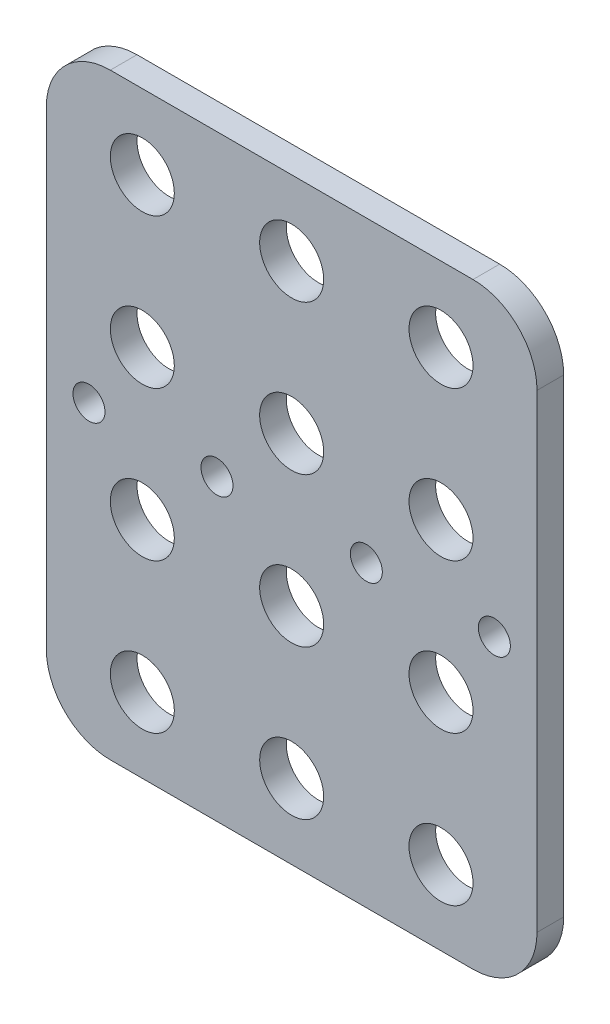
ISO-10303-21;
HEADER;
FILE_DESCRIPTION(('STEP AP214'),'2;1');
FILE_NAME('part.step','',(''),(''),'','','');
FILE_SCHEMA(('AUTOMOTIVE_DESIGN { 1 0 10303 214 1 1 1 1 }'));
ENDSEC;
DATA;
#1=APPLICATION_CONTEXT('core data for automotive mechanical design processes');
#2=APPLICATION_PROTOCOL_DEFINITION('international standard','automotive_design',2000,#1);
#3=PRODUCT_CONTEXT('',#1,'mechanical');
#4=PRODUCT('Part','Part','',(#3));
#5=PRODUCT_RELATED_PRODUCT_CATEGORY('part','',(#4));
#6=PRODUCT_DEFINITION_FORMATION('','',#4);
#7=PRODUCT_DEFINITION_CONTEXT('part definition',#1,'design');
#8=PRODUCT_DEFINITION('design','',#6,#7);
#9=PRODUCT_DEFINITION_SHAPE('','',#8);
#10=(LENGTH_UNIT() NAMED_UNIT(*) SI_UNIT(.MILLI.,.METRE.));
#11=(NAMED_UNIT(*) PLANE_ANGLE_UNIT() SI_UNIT($,.RADIAN.));
#12=(NAMED_UNIT(*) SI_UNIT($,.STERADIAN.) SOLID_ANGLE_UNIT());
#13=UNCERTAINTY_MEASURE_WITH_UNIT(LENGTH_MEASURE(1.E-05),#10,'distance_accuracy_value','');
#14=(GEOMETRIC_REPRESENTATION_CONTEXT(3) GLOBAL_UNCERTAINTY_ASSIGNED_CONTEXT((#13)) GLOBAL_UNIT_ASSIGNED_CONTEXT((#10,
#11,#12)) REPRESENTATION_CONTEXT('',''));
#15=CARTESIAN_POINT('',(0.,0.,0.));
#16=DIRECTION('',(0.,0.,1.));
#17=DIRECTION('',(1.,0.,0.));
#18=AXIS2_PLACEMENT_3D('',#15,#16,#17);
#19=CARTESIAN_POINT('',(23.,28.,2.5));
#20=DIRECTION('',(-1.,0.,0.));
#21=DIRECTION('',(0.,0.,1.));
#22=AXIS2_PLACEMENT_3D('',#19,#20,#21);
#23=PLANE('',#22);
#24=DIRECTION('',(0.,1.,0.));
#25=VECTOR('',#24,1.);
#26=CARTESIAN_POINT('',(23.,28.,0.));
#27=LINE('',#26,#25);
#28=CARTESIAN_POINT('',(23.,-22.,0.));
#29=VERTEX_POINT('',#28);
#30=CARTESIAN_POINT('',(23.,22.,0.));
#31=VERTEX_POINT('',#30);
#32=EDGE_CURVE('E132',#29,#31,#27,.T.);
#33=ORIENTED_EDGE('',*,*,#32,.T.);
#34=DIRECTION('',(0.,0.,-1.));
#35=VECTOR('',#34,1.);
#36=CARTESIAN_POINT('',(23.,22.,2.5));
#37=LINE('',#36,#35);
#38=CARTESIAN_POINT('',(23.,22.,2.5));
#39=VERTEX_POINT('',#38);
#40=EDGE_CURVE('E110',#31,#39,#37,.F.);
#41=ORIENTED_EDGE('',*,*,#40,.T.);
#42=DIRECTION('',(0.,1.,0.));
#43=VECTOR('',#42,1.);
#44=CARTESIAN_POINT('',(23.,28.,2.5));
#45=LINE('',#44,#43);
#46=CARTESIAN_POINT('',(23.,-22.,2.5));
#47=VERTEX_POINT('',#46);
#48=EDGE_CURVE('E142',#47,#39,#45,.T.);
#49=ORIENTED_EDGE('',*,*,#48,.F.);
#50=DIRECTION('',(0.,0.,-1.));
#51=VECTOR('',#50,1.);
#52=CARTESIAN_POINT('',(23.,-22.,2.5));
#53=LINE('',#52,#51);
#54=EDGE_CURVE('E115',#47,#29,#53,.T.);
#55=ORIENTED_EDGE('',*,*,#54,.T.);
#56=EDGE_LOOP('',(#33,#41,#49,#55));
#57=FACE_BOUND('',#56,.T.);
#58=ADVANCED_FACE('F37',(#57),#23,.F.);
#59=CARTESIAN_POINT('',(-23.,28.,2.5));
#60=DIRECTION('',(0.,-1.,0.));
#61=DIRECTION('',(0.,0.,-1.));
#62=AXIS2_PLACEMENT_3D('',#59,#60,#61);
#63=PLANE('',#62);
#64=DIRECTION('',(-1.,0.,0.));
#65=VECTOR('',#64,1.);
#66=CARTESIAN_POINT('',(-23.,28.,2.5));
#67=LINE('',#66,#65);
#68=CARTESIAN_POINT('',(17.,28.,2.5));
#69=VERTEX_POINT('',#68);
#70=CARTESIAN_POINT('',(-17.,28.,2.5));
#71=VERTEX_POINT('',#70);
#72=EDGE_CURVE('E125',#69,#71,#67,.T.);
#73=ORIENTED_EDGE('',*,*,#72,.F.);
#74=DIRECTION('',(0.,0.,-1.));
#75=VECTOR('',#74,1.);
#76=CARTESIAN_POINT('',(17.,28.,2.5));
#77=LINE('',#76,#75);
#78=CARTESIAN_POINT('',(17.,28.,0.));
#79=VERTEX_POINT('',#78);
#80=EDGE_CURVE('E109',#69,#79,#77,.T.);
#81=ORIENTED_EDGE('',*,*,#80,.T.);
#82=DIRECTION('',(-1.,0.,0.));
#83=VECTOR('',#82,1.);
#84=CARTESIAN_POINT('',(-23.,28.,0.));
#85=LINE('',#84,#83);
#86=CARTESIAN_POINT('',(-17.,28.,0.));
#87=VERTEX_POINT('',#86);
#88=EDGE_CURVE('E122',#79,#87,#85,.T.);
#89=ORIENTED_EDGE('',*,*,#88,.T.);
#90=DIRECTION('',(0.,0.,-1.));
#91=VECTOR('',#90,1.);
#92=CARTESIAN_POINT('',(-17.,28.,2.5));
#93=LINE('',#92,#91);
#94=EDGE_CURVE('E127',#87,#71,#93,.F.);
#95=ORIENTED_EDGE('',*,*,#94,.T.);
#96=EDGE_LOOP('',(#73,#81,#89,#95));
#97=FACE_BOUND('',#96,.T.);
#98=ADVANCED_FACE('F121',(#97),#63,.F.);
#99=CARTESIAN_POINT('',(-23.,28.,2.5));
#100=DIRECTION('',(1.,0.,0.));
#101=DIRECTION('',(0.,0.,-1.));
#102=AXIS2_PLACEMENT_3D('',#99,#100,#101);
#103=PLANE('',#102);
#104=DIRECTION('',(0.,-1.,0.));
#105=VECTOR('',#104,1.);
#106=CARTESIAN_POINT('',(-23.,28.,0.));
#107=LINE('',#106,#105);
#108=CARTESIAN_POINT('',(-23.,22.,0.));
#109=VERTEX_POINT('',#108);
#110=CARTESIAN_POINT('',(-23.,-22.,0.));
#111=VERTEX_POINT('',#110);
#112=EDGE_CURVE('E131',#109,#111,#107,.T.);
#113=ORIENTED_EDGE('',*,*,#112,.T.);
#114=DIRECTION('',(0.,0.,-1.));
#115=VECTOR('',#114,1.);
#116=CARTESIAN_POINT('',(-23.,-22.,2.5));
#117=LINE('',#116,#115);
#118=CARTESIAN_POINT('',(-23.,-22.,2.5));
#119=VERTEX_POINT('',#118);
#120=EDGE_CURVE('E11',#111,#119,#117,.F.);
#121=ORIENTED_EDGE('',*,*,#120,.T.);
#122=DIRECTION('',(0.,-1.,0.));
#123=VECTOR('',#122,1.);
#124=CARTESIAN_POINT('',(-23.,28.,2.5));
#125=LINE('',#124,#123);
#126=CARTESIAN_POINT('',(-23.,22.,2.5));
#127=VERTEX_POINT('',#126);
#128=EDGE_CURVE('E237',#127,#119,#125,.T.);
#129=ORIENTED_EDGE('',*,*,#128,.F.);
#130=DIRECTION('',(0.,0.,-1.));
#131=VECTOR('',#130,1.);
#132=CARTESIAN_POINT('',(-23.,22.,2.5));
#133=LINE('',#132,#131);
#134=EDGE_CURVE('E46',#127,#109,#133,.T.);
#135=ORIENTED_EDGE('',*,*,#134,.T.);
#136=EDGE_LOOP('',(#113,#121,#129,#135));
#137=FACE_BOUND('',#136,.T.);
#138=ADVANCED_FACE('F252',(#137),#103,.F.);
#139=CARTESIAN_POINT('',(-23.,-28.,2.5));
#140=DIRECTION('',(0.,1.,0.));
#141=DIRECTION('',(0.,0.,1.));
#142=AXIS2_PLACEMENT_3D('',#139,#140,#141);
#143=PLANE('',#142);
#144=DIRECTION('',(1.,0.,0.));
#145=VECTOR('',#144,1.);
#146=CARTESIAN_POINT('',(-23.,-28.,0.));
#147=LINE('',#146,#145);
#148=CARTESIAN_POINT('',(-17.,-28.,0.));
#149=VERTEX_POINT('',#148);
#150=CARTESIAN_POINT('',(17.,-28.,0.));
#151=VERTEX_POINT('',#150);
#152=EDGE_CURVE('E135',#149,#151,#147,.T.);
#153=ORIENTED_EDGE('',*,*,#152,.T.);
#154=DIRECTION('',(0.,0.,-1.));
#155=VECTOR('',#154,1.);
#156=CARTESIAN_POINT('',(17.,-28.,2.5));
#157=LINE('',#156,#155);
#158=CARTESIAN_POINT('',(17.,-28.,2.5));
#159=VERTEX_POINT('',#158);
#160=EDGE_CURVE('E54',#151,#159,#157,.F.);
#161=ORIENTED_EDGE('',*,*,#160,.T.);
#162=DIRECTION('',(1.,0.,0.));
#163=VECTOR('',#162,1.);
#164=CARTESIAN_POINT('',(-23.,-28.,2.5));
#165=LINE('',#164,#163);
#166=CARTESIAN_POINT('',(-17.,-28.,2.5));
#167=VERTEX_POINT('',#166);
#168=EDGE_CURVE('E143',#167,#159,#165,.T.);
#169=ORIENTED_EDGE('',*,*,#168,.F.);
#170=DIRECTION('',(0.,0.,-1.));
#171=VECTOR('',#170,1.);
#172=CARTESIAN_POINT('',(-17.,-28.,2.5));
#173=LINE('',#172,#171);
#174=EDGE_CURVE('E159',#167,#149,#173,.T.);
#175=ORIENTED_EDGE('',*,*,#174,.T.);
#176=EDGE_LOOP('',(#153,#161,#169,#175));
#177=FACE_BOUND('',#176,.T.);
#178=ADVANCED_FACE('F247',(#177),#143,.F.);
#179=CARTESIAN_POINT('',(0.,0.,2.5));
#180=DIRECTION('',(0.,0.,1.));
#181=DIRECTION('',(1.,0.,0.));
#182=AXIS2_PLACEMENT_3D('',#179,#180,#181);
#183=PLANE('',#182);
#184=CARTESIAN_POINT('',(-14.,-21.,2.5));
#185=DIRECTION('',(0.,0.,1.));
#186=DIRECTION('',(-1.,0.,0.));
#187=AXIS2_PLACEMENT_3D('',#184,#185,#186);
#188=CIRCLE('',#187,3.);
#189=CARTESIAN_POINT('',(-17.,-21.,2.5));
#190=VERTEX_POINT('',#189);
#191=EDGE_CURVE('E498',#190,#190,#188,.T.);
#192=ORIENTED_EDGE('',*,*,#191,.F.);
#193=EDGE_LOOP('',(#192));
#194=FACE_BOUND('',#193,.T.);
#195=CARTESIAN_POINT('',(0.,-21.,2.5));
#196=DIRECTION('',(0.,0.,1.));
#197=DIRECTION('',(-1.,0.,0.));
#198=AXIS2_PLACEMENT_3D('',#195,#196,#197);
#199=CIRCLE('',#198,3.);
#200=CARTESIAN_POINT('',(-2.99999999999999,-21.,2.5));
#201=VERTEX_POINT('',#200);
#202=EDGE_CURVE('E499',#201,#201,#199,.T.);
#203=ORIENTED_EDGE('',*,*,#202,.F.);
#204=EDGE_LOOP('',(#203));
#205=FACE_BOUND('',#204,.T.);
#206=CARTESIAN_POINT('',(14.,-21.,2.5));
#207=DIRECTION('',(0.,0.,1.));
#208=DIRECTION('',(-1.,0.,0.));
#209=AXIS2_PLACEMENT_3D('',#206,#207,#208);
#210=CIRCLE('',#209,3.);
#211=CARTESIAN_POINT('',(11.,-21.,2.5));
#212=VERTEX_POINT('',#211);
#213=EDGE_CURVE('E502',#212,#212,#210,.T.);
#214=ORIENTED_EDGE('',*,*,#213,.F.);
#215=EDGE_LOOP('',(#214));
#216=FACE_BOUND('',#215,.T.);
#217=CARTESIAN_POINT('',(14.,21.,2.5));
#218=DIRECTION('',(0.,0.,1.));
#219=DIRECTION('',(1.,0.,0.));
#220=AXIS2_PLACEMENT_3D('',#217,#218,#219);
#221=CIRCLE('',#220,3.);
#222=CARTESIAN_POINT('',(17.,21.,2.5));
#223=VERTEX_POINT('',#222);
#224=EDGE_CURVE('E571',#223,#223,#221,.T.);
#225=ORIENTED_EDGE('',*,*,#224,.F.);
#226=EDGE_LOOP('',(#225));
#227=FACE_BOUND('',#226,.T.);
#228=CARTESIAN_POINT('',(0.,21.,2.5));
#229=DIRECTION('',(0.,0.,1.));
#230=DIRECTION('',(1.,0.,0.));
#231=AXIS2_PLACEMENT_3D('',#228,#229,#230);
#232=CIRCLE('',#231,3.);
#233=CARTESIAN_POINT('',(3.00000000000001,21.,2.5));
#234=VERTEX_POINT('',#233);
#235=EDGE_CURVE('E567',#234,#234,#232,.T.);
#236=ORIENTED_EDGE('',*,*,#235,.F.);
#237=EDGE_LOOP('',(#236));
#238=FACE_BOUND('',#237,.T.);
#239=CARTESIAN_POINT('',(14.0000000000002,-7.,2.5));
#240=DIRECTION('',(0.,0.,1.));
#241=DIRECTION('',(1.,0.,0.));
#242=AXIS2_PLACEMENT_3D('',#239,#240,#241);
#243=CIRCLE('',#242,3.);
#244=CARTESIAN_POINT('',(17.0000000000002,-7.,2.5));
#245=VERTEX_POINT('',#244);
#246=EDGE_CURVE('E514',#245,#245,#243,.T.);
#247=ORIENTED_EDGE('',*,*,#246,.F.);
#248=EDGE_LOOP('',(#247));
#249=FACE_BOUND('',#248,.T.);
#250=CARTESIAN_POINT('',(0.,7.,2.5));
#251=DIRECTION('',(0.,0.,1.));
#252=DIRECTION('',(1.,0.,0.));
#253=AXIS2_PLACEMENT_3D('',#250,#251,#252);
#254=CIRCLE('',#253,3.);
#255=CARTESIAN_POINT('',(3.00000000000001,7.,2.5));
#256=VERTEX_POINT('',#255);
#257=EDGE_CURVE('E187',#256,#256,#254,.T.);
#258=ORIENTED_EDGE('',*,*,#257,.F.);
#259=EDGE_LOOP('',(#258));
#260=FACE_BOUND('',#259,.T.);
#261=CARTESIAN_POINT('',(14.,7.,2.5));
#262=DIRECTION('',(0.,0.,1.));
#263=DIRECTION('',(1.,0.,0.));
#264=AXIS2_PLACEMENT_3D('',#261,#262,#263);
#265=CIRCLE('',#264,3.);
#266=CARTESIAN_POINT('',(17.,7.,2.5));
#267=VERTEX_POINT('',#266);
#268=EDGE_CURVE('E223',#267,#267,#265,.T.);
#269=ORIENTED_EDGE('',*,*,#268,.F.);
#270=EDGE_LOOP('',(#269));
#271=FACE_BOUND('',#270,.T.);
#272=CARTESIAN_POINT('',(-14.,21.,2.5));
#273=DIRECTION('',(0.,0.,1.));
#274=DIRECTION('',(1.,0.,0.));
#275=AXIS2_PLACEMENT_3D('',#272,#273,#274);
#276=CIRCLE('',#275,3.);
#277=CARTESIAN_POINT('',(-11.,21.,2.5));
#278=VERTEX_POINT('',#277);
#279=EDGE_CURVE('E506',#278,#278,#276,.T.);
#280=ORIENTED_EDGE('',*,*,#279,.F.);
#281=EDGE_LOOP('',(#280));
#282=FACE_BOUND('',#281,.T.);
#283=CARTESIAN_POINT('',(-13.9999999999998,-7.,2.5));
#284=DIRECTION('',(0.,0.,1.));
#285=DIRECTION('',(1.,0.,0.));
#286=AXIS2_PLACEMENT_3D('',#283,#284,#285);
#287=CIRCLE('',#286,3.);
#288=CARTESIAN_POINT('',(-10.9999999999998,-7.,2.5));
#289=VERTEX_POINT('',#288);
#290=EDGE_CURVE('E509',#289,#289,#287,.T.);
#291=ORIENTED_EDGE('',*,*,#290,.F.);
#292=EDGE_LOOP('',(#291));
#293=FACE_BOUND('',#292,.T.);
#294=CARTESIAN_POINT('',(1.60520004039226E-13,-7.,2.5));
#295=DIRECTION('',(0.,0.,1.));
#296=DIRECTION('',(1.,0.,0.));
#297=AXIS2_PLACEMENT_3D('',#294,#295,#296);
#298=CIRCLE('',#297,3.);
#299=CARTESIAN_POINT('',(3.00000000000016,-7.,2.5));
#300=VERTEX_POINT('',#299);
#301=EDGE_CURVE('E512',#300,#300,#298,.T.);
#302=ORIENTED_EDGE('',*,*,#301,.F.);
#303=EDGE_LOOP('',(#302));
#304=FACE_BOUND('',#303,.T.);
#305=CARTESIAN_POINT('',(-14.,7.,2.5));
#306=DIRECTION('',(0.,0.,1.));
#307=DIRECTION('',(1.,0.,0.));
#308=AXIS2_PLACEMENT_3D('',#305,#306,#307);
#309=CIRCLE('',#308,3.);
#310=CARTESIAN_POINT('',(-11.,7.,2.5));
#311=VERTEX_POINT('',#310);
#312=EDGE_CURVE('E182',#311,#311,#309,.T.);
#313=ORIENTED_EDGE('',*,*,#312,.F.);
#314=EDGE_LOOP('',(#313));
#315=FACE_BOUND('',#314,.T.);
#316=CARTESIAN_POINT('',(-6.99999999999999,0.,2.5));
#317=DIRECTION('',(0.,0.,1.));
#318=DIRECTION('',(1.,0.,0.));
#319=AXIS2_PLACEMENT_3D('',#316,#317,#318);
#320=CIRCLE('',#319,1.5);
#321=CARTESIAN_POINT('',(-5.49999999999999,0.,2.5));
#322=VERTEX_POINT('',#321);
#323=EDGE_CURVE('E172',#322,#322,#320,.T.);
#324=ORIENTED_EDGE('',*,*,#323,.F.);
#325=EDGE_LOOP('',(#324));
#326=FACE_BOUND('',#325,.T.);
#327=CARTESIAN_POINT('',(6.99999999999999,0.,2.5));
#328=DIRECTION('',(0.,0.,1.));
#329=DIRECTION('',(-1.,0.,0.));
#330=AXIS2_PLACEMENT_3D('',#327,#328,#329);
#331=CIRCLE('',#330,1.5);
#332=CARTESIAN_POINT('',(5.49999999999999,0.,2.5));
#333=VERTEX_POINT('',#332);
#334=EDGE_CURVE('E227',#333,#333,#331,.T.);
#335=ORIENTED_EDGE('',*,*,#334,.F.);
#336=EDGE_LOOP('',(#335));
#337=FACE_BOUND('',#336,.T.);
#338=CARTESIAN_POINT('',(19.,0.,2.5));
#339=DIRECTION('',(0.,0.,1.));
#340=DIRECTION('',(-1.,0.,0.));
#341=AXIS2_PLACEMENT_3D('',#338,#339,#340);
#342=CIRCLE('',#341,1.5);
#343=CARTESIAN_POINT('',(17.5,0.,2.5));
#344=VERTEX_POINT('',#343);
#345=EDGE_CURVE('E181',#344,#344,#342,.T.);
#346=ORIENTED_EDGE('',*,*,#345,.F.);
#347=EDGE_LOOP('',(#346));
#348=FACE_BOUND('',#347,.T.);
#349=CARTESIAN_POINT('',(-19.,0.,2.5));
#350=DIRECTION('',(0.,0.,1.));
#351=DIRECTION('',(1.,0.,0.));
#352=AXIS2_PLACEMENT_3D('',#349,#350,#351);
#353=CIRCLE('',#352,1.5);
#354=CARTESIAN_POINT('',(-17.5,0.,2.5));
#355=VERTEX_POINT('',#354);
#356=EDGE_CURVE('E167',#355,#355,#353,.T.);
#357=ORIENTED_EDGE('',*,*,#356,.F.);
#358=EDGE_LOOP('',(#357));
#359=FACE_BOUND('',#358,.T.);
#360=ORIENTED_EDGE('',*,*,#48,.T.);
#361=CARTESIAN_POINT('',(17.,22.,2.5));
#362=DIRECTION('',(0.,0.,1.));
#363=DIRECTION('',(1.,0.,0.));
#364=AXIS2_PLACEMENT_3D('',#361,#362,#363);
#365=CIRCLE('',#364,6.);
#366=EDGE_CURVE('E157',#39,#69,#365,.T.);
#367=ORIENTED_EDGE('',*,*,#366,.T.);
#368=ORIENTED_EDGE('',*,*,#72,.T.);
#369=CARTESIAN_POINT('',(-17.,22.,2.5));
#370=DIRECTION('',(0.,0.,1.));
#371=DIRECTION('',(1.,0.,0.));
#372=AXIS2_PLACEMENT_3D('',#369,#370,#371);
#373=CIRCLE('',#372,6.);
#374=EDGE_CURVE('E152',#71,#127,#373,.T.);
#375=ORIENTED_EDGE('',*,*,#374,.T.);
#376=ORIENTED_EDGE('',*,*,#128,.T.);
#377=CARTESIAN_POINT('',(-17.,-22.,2.5));
#378=DIRECTION('',(0.,0.,1.));
#379=DIRECTION('',(1.,0.,0.));
#380=AXIS2_PLACEMENT_3D('',#377,#378,#379);
#381=CIRCLE('',#380,6.);
#382=EDGE_CURVE('E61',#119,#167,#381,.T.);
#383=ORIENTED_EDGE('',*,*,#382,.T.);
#384=ORIENTED_EDGE('',*,*,#168,.T.);
#385=CARTESIAN_POINT('',(17.,-22.,2.5));
#386=DIRECTION('',(0.,0.,1.));
#387=DIRECTION('',(1.,0.,0.));
#388=AXIS2_PLACEMENT_3D('',#385,#386,#387);
#389=CIRCLE('',#388,6.);
#390=EDGE_CURVE('E155',#159,#47,#389,.T.);
#391=ORIENTED_EDGE('',*,*,#390,.T.);
#392=EDGE_LOOP('',(#360,#367,#368,#375,#376,#383,#384,#391));
#393=FACE_BOUND('',#392,.T.);
#394=ADVANCED_FACE('F239',(#194,#205,#216,#227,#238,#249,#260,#271,#282,#293,#304,#315,#326,
#337,#348,#359,#393),#183,.T.);
#395=CARTESIAN_POINT('',(0.,0.,0.));
#396=DIRECTION('',(0.,0.,1.));
#397=DIRECTION('',(1.,0.,0.));
#398=AXIS2_PLACEMENT_3D('',#395,#396,#397);
#399=PLANE('',#398);
#400=CARTESIAN_POINT('',(-14.,-21.,0.));
#401=DIRECTION('',(0.,0.,1.));
#402=DIRECTION('',(1.,0.,0.));
#403=AXIS2_PLACEMENT_3D('',#400,#401,#402);
#404=CIRCLE('',#403,3.);
#405=CARTESIAN_POINT('',(-11.,-21.,0.));
#406=VERTEX_POINT('',#405);
#407=EDGE_CURVE('E41',#406,#406,#404,.T.);
#408=ORIENTED_EDGE('',*,*,#407,.T.);
#409=EDGE_LOOP('',(#408));
#410=FACE_BOUND('',#409,.T.);
#411=CARTESIAN_POINT('',(0.,-21.,0.));
#412=DIRECTION('',(0.,0.,1.));
#413=DIRECTION('',(1.,0.,0.));
#414=AXIS2_PLACEMENT_3D('',#411,#412,#413);
#415=CIRCLE('',#414,3.);
#416=CARTESIAN_POINT('',(3.00000000000001,-21.,0.));
#417=VERTEX_POINT('',#416);
#418=EDGE_CURVE('E210',#417,#417,#415,.T.);
#419=ORIENTED_EDGE('',*,*,#418,.T.);
#420=EDGE_LOOP('',(#419));
#421=FACE_BOUND('',#420,.T.);
#422=CARTESIAN_POINT('',(14.,-21.,0.));
#423=DIRECTION('',(0.,0.,1.));
#424=DIRECTION('',(1.,0.,0.));
#425=AXIS2_PLACEMENT_3D('',#422,#423,#424);
#426=CIRCLE('',#425,3.);
#427=CARTESIAN_POINT('',(17.,-21.,0.));
#428=VERTEX_POINT('',#427);
#429=EDGE_CURVE('E208',#428,#428,#426,.T.);
#430=ORIENTED_EDGE('',*,*,#429,.T.);
#431=EDGE_LOOP('',(#430));
#432=FACE_BOUND('',#431,.T.);
#433=CARTESIAN_POINT('',(14.,21.,0.));
#434=DIRECTION('',(0.,0.,1.));
#435=DIRECTION('',(1.,0.,0.));
#436=AXIS2_PLACEMENT_3D('',#433,#434,#435);
#437=CIRCLE('',#436,3.);
#438=CARTESIAN_POINT('',(17.,21.,0.));
#439=VERTEX_POINT('',#438);
#440=EDGE_CURVE('E205',#439,#439,#437,.T.);
#441=ORIENTED_EDGE('',*,*,#440,.T.);
#442=EDGE_LOOP('',(#441));
#443=FACE_BOUND('',#442,.T.);
#444=CARTESIAN_POINT('',(0.,21.,0.));
#445=DIRECTION('',(0.,0.,1.));
#446=DIRECTION('',(1.,0.,0.));
#447=AXIS2_PLACEMENT_3D('',#444,#445,#446);
#448=CIRCLE('',#447,3.);
#449=CARTESIAN_POINT('',(3.00000000000001,21.,0.));
#450=VERTEX_POINT('',#449);
#451=EDGE_CURVE('E202',#450,#450,#448,.T.);
#452=ORIENTED_EDGE('',*,*,#451,.T.);
#453=EDGE_LOOP('',(#452));
#454=FACE_BOUND('',#453,.T.);
#455=CARTESIAN_POINT('',(14.0000000000002,-7.,0.));
#456=DIRECTION('',(0.,0.,1.));
#457=DIRECTION('',(1.,0.,0.));
#458=AXIS2_PLACEMENT_3D('',#455,#456,#457);
#459=CIRCLE('',#458,3.);
#460=CARTESIAN_POINT('',(17.0000000000002,-7.,0.));
#461=VERTEX_POINT('',#460);
#462=EDGE_CURVE('E199',#461,#461,#459,.T.);
#463=ORIENTED_EDGE('',*,*,#462,.T.);
#464=EDGE_LOOP('',(#463));
#465=FACE_BOUND('',#464,.T.);
#466=CARTESIAN_POINT('',(0.,7.,0.));
#467=DIRECTION('',(0.,0.,1.));
#468=DIRECTION('',(1.,0.,0.));
#469=AXIS2_PLACEMENT_3D('',#466,#467,#468);
#470=CIRCLE('',#469,3.);
#471=CARTESIAN_POINT('',(3.00000000000001,7.,0.));
#472=VERTEX_POINT('',#471);
#473=EDGE_CURVE('E196',#472,#472,#470,.T.);
#474=ORIENTED_EDGE('',*,*,#473,.T.);
#475=EDGE_LOOP('',(#474));
#476=FACE_BOUND('',#475,.T.);
#477=CARTESIAN_POINT('',(14.,7.,0.));
#478=DIRECTION('',(0.,0.,1.));
#479=DIRECTION('',(1.,0.,0.));
#480=AXIS2_PLACEMENT_3D('',#477,#478,#479);
#481=CIRCLE('',#480,3.);
#482=CARTESIAN_POINT('',(17.,7.,0.));
#483=VERTEX_POINT('',#482);
#484=EDGE_CURVE('E193',#483,#483,#481,.T.);
#485=ORIENTED_EDGE('',*,*,#484,.T.);
#486=EDGE_LOOP('',(#485));
#487=FACE_BOUND('',#486,.T.);
#488=CARTESIAN_POINT('',(-14.,21.,0.));
#489=DIRECTION('',(0.,0.,1.));
#490=DIRECTION('',(1.,0.,0.));
#491=AXIS2_PLACEMENT_3D('',#488,#489,#490);
#492=CIRCLE('',#491,3.);
#493=CARTESIAN_POINT('',(-11.,21.,0.));
#494=VERTEX_POINT('',#493);
#495=EDGE_CURVE('E190',#494,#494,#492,.T.);
#496=ORIENTED_EDGE('',*,*,#495,.T.);
#497=EDGE_LOOP('',(#496));
#498=FACE_BOUND('',#497,.T.);
#499=CARTESIAN_POINT('',(-13.9999999999998,-7.,0.));
#500=DIRECTION('',(0.,0.,1.));
#501=DIRECTION('',(1.,0.,0.));
#502=AXIS2_PLACEMENT_3D('',#499,#500,#501);
#503=CIRCLE('',#502,3.);
#504=CARTESIAN_POINT('',(-10.9999999999998,-7.,0.));
#505=VERTEX_POINT('',#504);
#506=EDGE_CURVE('E186',#505,#505,#503,.T.);
#507=ORIENTED_EDGE('',*,*,#506,.T.);
#508=EDGE_LOOP('',(#507));
#509=FACE_BOUND('',#508,.T.);
#510=CARTESIAN_POINT('',(1.60520004039226E-13,-7.,0.));
#511=DIRECTION('',(0.,0.,1.));
#512=DIRECTION('',(1.,0.,0.));
#513=AXIS2_PLACEMENT_3D('',#510,#511,#512);
#514=CIRCLE('',#513,3.);
#515=CARTESIAN_POINT('',(3.00000000000016,-7.,0.));
#516=VERTEX_POINT('',#515);
#517=EDGE_CURVE('E183',#516,#516,#514,.T.);
#518=ORIENTED_EDGE('',*,*,#517,.T.);
#519=EDGE_LOOP('',(#518));
#520=FACE_BOUND('',#519,.T.);
#521=CARTESIAN_POINT('',(-14.,7.,0.));
#522=DIRECTION('',(0.,0.,1.));
#523=DIRECTION('',(1.,0.,0.));
#524=AXIS2_PLACEMENT_3D('',#521,#522,#523);
#525=CIRCLE('',#524,3.);
#526=CARTESIAN_POINT('',(-11.,7.,0.));
#527=VERTEX_POINT('',#526);
#528=EDGE_CURVE('E178',#527,#527,#525,.T.);
#529=ORIENTED_EDGE('',*,*,#528,.T.);
#530=EDGE_LOOP('',(#529));
#531=FACE_BOUND('',#530,.T.);
#532=CARTESIAN_POINT('',(-6.99999999999999,0.,0.));
#533=DIRECTION('',(0.,0.,1.));
#534=DIRECTION('',(1.,0.,0.));
#535=AXIS2_PLACEMENT_3D('',#532,#533,#534);
#536=CIRCLE('',#535,1.5);
#537=CARTESIAN_POINT('',(-5.49999999999999,0.,0.));
#538=VERTEX_POINT('',#537);
#539=EDGE_CURVE('E175',#538,#538,#536,.T.);
#540=ORIENTED_EDGE('',*,*,#539,.T.);
#541=EDGE_LOOP('',(#540));
#542=FACE_BOUND('',#541,.T.);
#543=CARTESIAN_POINT('',(6.99999999999999,0.,0.));
#544=DIRECTION('',(0.,0.,1.));
#545=DIRECTION('',(1.,0.,0.));
#546=AXIS2_PLACEMENT_3D('',#543,#544,#545);
#547=CIRCLE('',#546,1.5);
#548=CARTESIAN_POINT('',(8.49999999999999,0.,0.));
#549=VERTEX_POINT('',#548);
#550=EDGE_CURVE('E171',#549,#549,#547,.T.);
#551=ORIENTED_EDGE('',*,*,#550,.T.);
#552=EDGE_LOOP('',(#551));
#553=FACE_BOUND('',#552,.T.);
#554=CARTESIAN_POINT('',(19.,0.,0.));
#555=DIRECTION('',(0.,0.,1.));
#556=DIRECTION('',(1.,0.,0.));
#557=AXIS2_PLACEMENT_3D('',#554,#555,#556);
#558=CIRCLE('',#557,1.5);
#559=CARTESIAN_POINT('',(20.5,0.,0.));
#560=VERTEX_POINT('',#559);
#561=EDGE_CURVE('E168',#560,#560,#558,.T.);
#562=ORIENTED_EDGE('',*,*,#561,.T.);
#563=EDGE_LOOP('',(#562));
#564=FACE_BOUND('',#563,.T.);
#565=CARTESIAN_POINT('',(-19.,0.,0.));
#566=DIRECTION('',(0.,0.,1.));
#567=DIRECTION('',(1.,0.,0.));
#568=AXIS2_PLACEMENT_3D('',#565,#566,#567);
#569=CIRCLE('',#568,1.5);
#570=CARTESIAN_POINT('',(-17.5,0.,0.));
#571=VERTEX_POINT('',#570);
#572=EDGE_CURVE('E137',#571,#571,#569,.T.);
#573=ORIENTED_EDGE('',*,*,#572,.T.);
#574=EDGE_LOOP('',(#573));
#575=FACE_BOUND('',#574,.T.);
#576=ORIENTED_EDGE('',*,*,#88,.F.);
#577=CARTESIAN_POINT('',(17.,22.,0.));
#578=DIRECTION('',(0.,0.,1.));
#579=DIRECTION('',(1.,0.,0.));
#580=AXIS2_PLACEMENT_3D('',#577,#578,#579);
#581=CIRCLE('',#580,6.);
#582=EDGE_CURVE('E105',#79,#31,#581,.F.);
#583=ORIENTED_EDGE('',*,*,#582,.T.);
#584=ORIENTED_EDGE('',*,*,#32,.F.);
#585=CARTESIAN_POINT('',(17.,-22.,0.));
#586=DIRECTION('',(0.,0.,1.));
#587=DIRECTION('',(1.,0.,0.));
#588=AXIS2_PLACEMENT_3D('',#585,#586,#587);
#589=CIRCLE('',#588,6.);
#590=EDGE_CURVE('E116',#29,#151,#589,.F.);
#591=ORIENTED_EDGE('',*,*,#590,.T.);
#592=ORIENTED_EDGE('',*,*,#152,.F.);
#593=CARTESIAN_POINT('',(-17.,-22.,0.));
#594=DIRECTION('',(0.,0.,1.));
#595=DIRECTION('',(1.,0.,0.));
#596=AXIS2_PLACEMENT_3D('',#593,#594,#595);
#597=CIRCLE('',#596,6.);
#598=EDGE_CURVE('E146',#149,#111,#597,.F.);
#599=ORIENTED_EDGE('',*,*,#598,.T.);
#600=ORIENTED_EDGE('',*,*,#112,.F.);
#601=CARTESIAN_POINT('',(-17.,22.,0.));
#602=DIRECTION('',(0.,0.,1.));
#603=DIRECTION('',(1.,0.,0.));
#604=AXIS2_PLACEMENT_3D('',#601,#602,#603);
#605=CIRCLE('',#604,6.);
#606=EDGE_CURVE('E126',#109,#87,#605,.F.);
#607=ORIENTED_EDGE('',*,*,#606,.T.);
#608=EDGE_LOOP('',(#576,#583,#584,#591,#592,#599,#600,#607));
#609=FACE_BOUND('',#608,.T.);
#610=ADVANCED_FACE('F129',(#410,#421,#432,#443,#454,#465,#476,#487,#498,#509,#520,#531,#542,
#553,#564,#575,#609),#399,.F.);
#611=CARTESIAN_POINT('',(17.,22.,2.5));
#612=DIRECTION('',(0.,0.,-1.));
#613=DIRECTION('',(-1.,0.,0.));
#614=AXIS2_PLACEMENT_3D('',#611,#612,#613);
#615=CYLINDRICAL_SURFACE('',#614,6.);
#616=ORIENTED_EDGE('',*,*,#366,.F.);
#617=ORIENTED_EDGE('',*,*,#40,.F.);
#618=ORIENTED_EDGE('',*,*,#582,.F.);
#619=ORIENTED_EDGE('',*,*,#80,.F.);
#620=EDGE_LOOP('',(#616,#617,#618,#619));
#621=FACE_BOUND('',#620,.T.);
#622=ADVANCED_FACE('F108',(#621),#615,.T.);
#623=CARTESIAN_POINT('',(17.,-22.,2.5));
#624=DIRECTION('',(0.,0.,-1.));
#625=DIRECTION('',(-1.,0.,0.));
#626=AXIS2_PLACEMENT_3D('',#623,#624,#625);
#627=CYLINDRICAL_SURFACE('',#626,6.);
#628=ORIENTED_EDGE('',*,*,#390,.F.);
#629=ORIENTED_EDGE('',*,*,#160,.F.);
#630=ORIENTED_EDGE('',*,*,#590,.F.);
#631=ORIENTED_EDGE('',*,*,#54,.F.);
#632=EDGE_LOOP('',(#628,#629,#630,#631));
#633=FACE_BOUND('',#632,.T.);
#634=ADVANCED_FACE('F244',(#633),#627,.T.);
#635=CARTESIAN_POINT('',(-17.,-22.,2.5));
#636=DIRECTION('',(0.,0.,-1.));
#637=DIRECTION('',(-1.,0.,0.));
#638=AXIS2_PLACEMENT_3D('',#635,#636,#637);
#639=CYLINDRICAL_SURFACE('',#638,6.);
#640=ORIENTED_EDGE('',*,*,#382,.F.);
#641=ORIENTED_EDGE('',*,*,#120,.F.);
#642=ORIENTED_EDGE('',*,*,#598,.F.);
#643=ORIENTED_EDGE('',*,*,#174,.F.);
#644=EDGE_LOOP('',(#640,#641,#642,#643));
#645=FACE_BOUND('',#644,.T.);
#646=ADVANCED_FACE('F249',(#645),#639,.T.);
#647=CARTESIAN_POINT('',(-17.,22.,2.5));
#648=DIRECTION('',(0.,0.,-1.));
#649=DIRECTION('',(-1.,0.,0.));
#650=AXIS2_PLACEMENT_3D('',#647,#648,#649);
#651=CYLINDRICAL_SURFACE('',#650,6.);
#652=ORIENTED_EDGE('',*,*,#374,.F.);
#653=ORIENTED_EDGE('',*,*,#94,.F.);
#654=ORIENTED_EDGE('',*,*,#606,.F.);
#655=ORIENTED_EDGE('',*,*,#134,.F.);
#656=EDGE_LOOP('',(#652,#653,#654,#655));
#657=FACE_BOUND('',#656,.T.);
#658=ADVANCED_FACE('F39',(#657),#651,.T.);
#659=CARTESIAN_POINT('',(-19.,0.,-7.5));
#660=DIRECTION('',(0.,0.,1.));
#661=DIRECTION('',(1.,0.,0.));
#662=AXIS2_PLACEMENT_3D('',#659,#660,#661);
#663=CYLINDRICAL_SURFACE('',#662,1.5);
#664=ORIENTED_EDGE('',*,*,#356,.T.);
#665=EDGE_LOOP('',(#664));
#666=FACE_BOUND('',#665,.T.);
#667=ORIENTED_EDGE('',*,*,#572,.F.);
#668=EDGE_LOOP('',(#667));
#669=FACE_BOUND('',#668,.T.);
#670=ADVANCED_FACE('F258',(#666,#669),#663,.F.);
#671=CARTESIAN_POINT('',(19.,0.,-7.5));
#672=DIRECTION('',(0.,0.,1.));
#673=DIRECTION('',(1.,0.,0.));
#674=AXIS2_PLACEMENT_3D('',#671,#672,#673);
#675=CYLINDRICAL_SURFACE('',#674,1.5);
#676=ORIENTED_EDGE('',*,*,#345,.T.);
#677=EDGE_LOOP('',(#676));
#678=FACE_BOUND('',#677,.T.);
#679=ORIENTED_EDGE('',*,*,#561,.F.);
#680=EDGE_LOOP('',(#679));
#681=FACE_BOUND('',#680,.T.);
#682=ADVANCED_FACE('F263',(#678,#681),#675,.F.);
#683=CARTESIAN_POINT('',(6.99999999999999,0.,-7.5));
#684=DIRECTION('',(0.,0.,1.));
#685=DIRECTION('',(1.,0.,0.));
#686=AXIS2_PLACEMENT_3D('',#683,#684,#685);
#687=CYLINDRICAL_SURFACE('',#686,1.5);
#688=ORIENTED_EDGE('',*,*,#334,.T.);
#689=EDGE_LOOP('',(#688));
#690=FACE_BOUND('',#689,.T.);
#691=ORIENTED_EDGE('',*,*,#550,.F.);
#692=EDGE_LOOP('',(#691));
#693=FACE_BOUND('',#692,.T.);
#694=ADVANCED_FACE('F305',(#690,#693),#687,.F.);
#695=CARTESIAN_POINT('',(-6.99999999999999,0.,-7.5));
#696=DIRECTION('',(0.,0.,1.));
#697=DIRECTION('',(1.,0.,0.));
#698=AXIS2_PLACEMENT_3D('',#695,#696,#697);
#699=CYLINDRICAL_SURFACE('',#698,1.5);
#700=ORIENTED_EDGE('',*,*,#323,.T.);
#701=EDGE_LOOP('',(#700));
#702=FACE_BOUND('',#701,.T.);
#703=ORIENTED_EDGE('',*,*,#539,.F.);
#704=EDGE_LOOP('',(#703));
#705=FACE_BOUND('',#704,.T.);
#706=ADVANCED_FACE('F315',(#702,#705),#699,.F.);
#707=CARTESIAN_POINT('',(-14.,7.,-7.5));
#708=DIRECTION('',(0.,0.,1.));
#709=DIRECTION('',(1.,0.,0.));
#710=AXIS2_PLACEMENT_3D('',#707,#708,#709);
#711=CYLINDRICAL_SURFACE('',#710,3.);
#712=ORIENTED_EDGE('',*,*,#312,.T.);
#713=EDGE_LOOP('',(#712));
#714=FACE_BOUND('',#713,.T.);
#715=ORIENTED_EDGE('',*,*,#528,.F.);
#716=EDGE_LOOP('',(#715));
#717=FACE_BOUND('',#716,.T.);
#718=ADVANCED_FACE('F325',(#714,#717),#711,.F.);
#719=CARTESIAN_POINT('',(1.60520004039226E-13,-7.,-7.5));
#720=DIRECTION('',(0.,0.,1.));
#721=DIRECTION('',(1.,0.,0.));
#722=AXIS2_PLACEMENT_3D('',#719,#720,#721);
#723=CYLINDRICAL_SURFACE('',#722,3.);
#724=ORIENTED_EDGE('',*,*,#301,.T.);
#725=EDGE_LOOP('',(#724));
#726=FACE_BOUND('',#725,.T.);
#727=ORIENTED_EDGE('',*,*,#517,.F.);
#728=EDGE_LOOP('',(#727));
#729=FACE_BOUND('',#728,.T.);
#730=ADVANCED_FACE('F354',(#726,#729),#723,.F.);
#731=CARTESIAN_POINT('',(-13.9999999999998,-7.,-7.5));
#732=DIRECTION('',(0.,0.,1.));
#733=DIRECTION('',(1.,0.,0.));
#734=AXIS2_PLACEMENT_3D('',#731,#732,#733);
#735=CYLINDRICAL_SURFACE('',#734,3.);
#736=ORIENTED_EDGE('',*,*,#290,.T.);
#737=EDGE_LOOP('',(#736));
#738=FACE_BOUND('',#737,.T.);
#739=ORIENTED_EDGE('',*,*,#506,.F.);
#740=EDGE_LOOP('',(#739));
#741=FACE_BOUND('',#740,.T.);
#742=ADVANCED_FACE('F363',(#738,#741),#735,.F.);
#743=CARTESIAN_POINT('',(-14.,21.,-7.5));
#744=DIRECTION('',(0.,0.,1.));
#745=DIRECTION('',(1.,0.,0.));
#746=AXIS2_PLACEMENT_3D('',#743,#744,#745);
#747=CYLINDRICAL_SURFACE('',#746,3.);
#748=ORIENTED_EDGE('',*,*,#279,.T.);
#749=EDGE_LOOP('',(#748));
#750=FACE_BOUND('',#749,.T.);
#751=ORIENTED_EDGE('',*,*,#495,.F.);
#752=EDGE_LOOP('',(#751));
#753=FACE_BOUND('',#752,.T.);
#754=ADVANCED_FACE('F373',(#750,#753),#747,.F.);
#755=CARTESIAN_POINT('',(14.,7.,-7.5));
#756=DIRECTION('',(0.,0.,1.));
#757=DIRECTION('',(1.,0.,0.));
#758=AXIS2_PLACEMENT_3D('',#755,#756,#757);
#759=CYLINDRICAL_SURFACE('',#758,3.);
#760=ORIENTED_EDGE('',*,*,#268,.T.);
#761=EDGE_LOOP('',(#760));
#762=FACE_BOUND('',#761,.T.);
#763=ORIENTED_EDGE('',*,*,#484,.F.);
#764=EDGE_LOOP('',(#763));
#765=FACE_BOUND('',#764,.T.);
#766=ADVANCED_FACE('F383',(#762,#765),#759,.F.);
#767=CARTESIAN_POINT('',(0.,7.,-7.5));
#768=DIRECTION('',(0.,0.,1.));
#769=DIRECTION('',(1.,0.,0.));
#770=AXIS2_PLACEMENT_3D('',#767,#768,#769);
#771=CYLINDRICAL_SURFACE('',#770,3.);
#772=ORIENTED_EDGE('',*,*,#257,.T.);
#773=EDGE_LOOP('',(#772));
#774=FACE_BOUND('',#773,.T.);
#775=ORIENTED_EDGE('',*,*,#473,.F.);
#776=EDGE_LOOP('',(#775));
#777=FACE_BOUND('',#776,.T.);
#778=ADVANCED_FACE('F393',(#774,#777),#771,.F.);
#779=CARTESIAN_POINT('',(14.0000000000002,-7.,-7.5));
#780=DIRECTION('',(0.,0.,1.));
#781=DIRECTION('',(1.,0.,0.));
#782=AXIS2_PLACEMENT_3D('',#779,#780,#781);
#783=CYLINDRICAL_SURFACE('',#782,3.);
#784=ORIENTED_EDGE('',*,*,#246,.T.);
#785=EDGE_LOOP('',(#784));
#786=FACE_BOUND('',#785,.T.);
#787=ORIENTED_EDGE('',*,*,#462,.F.);
#788=EDGE_LOOP('',(#787));
#789=FACE_BOUND('',#788,.T.);
#790=ADVANCED_FACE('F403',(#786,#789),#783,.F.);
#791=CARTESIAN_POINT('',(0.,21.,-7.5));
#792=DIRECTION('',(0.,0.,1.));
#793=DIRECTION('',(1.,0.,0.));
#794=AXIS2_PLACEMENT_3D('',#791,#792,#793);
#795=CYLINDRICAL_SURFACE('',#794,3.);
#796=ORIENTED_EDGE('',*,*,#235,.T.);
#797=EDGE_LOOP('',(#796));
#798=FACE_BOUND('',#797,.T.);
#799=ORIENTED_EDGE('',*,*,#451,.F.);
#800=EDGE_LOOP('',(#799));
#801=FACE_BOUND('',#800,.T.);
#802=ADVANCED_FACE('F413',(#798,#801),#795,.F.);
#803=CARTESIAN_POINT('',(14.,21.,-7.5));
#804=DIRECTION('',(0.,0.,1.));
#805=DIRECTION('',(1.,0.,0.));
#806=AXIS2_PLACEMENT_3D('',#803,#804,#805);
#807=CYLINDRICAL_SURFACE('',#806,3.);
#808=ORIENTED_EDGE('',*,*,#224,.T.);
#809=EDGE_LOOP('',(#808));
#810=FACE_BOUND('',#809,.T.);
#811=ORIENTED_EDGE('',*,*,#440,.F.);
#812=EDGE_LOOP('',(#811));
#813=FACE_BOUND('',#812,.T.);
#814=ADVANCED_FACE('F423',(#810,#813),#807,.F.);
#815=CARTESIAN_POINT('',(14.,-21.,-7.5));
#816=DIRECTION('',(0.,0.,1.));
#817=DIRECTION('',(1.,0.,0.));
#818=AXIS2_PLACEMENT_3D('',#815,#816,#817);
#819=CYLINDRICAL_SURFACE('',#818,3.);
#820=ORIENTED_EDGE('',*,*,#213,.T.);
#821=EDGE_LOOP('',(#820));
#822=FACE_BOUND('',#821,.T.);
#823=ORIENTED_EDGE('',*,*,#429,.F.);
#824=EDGE_LOOP('',(#823));
#825=FACE_BOUND('',#824,.T.);
#826=ADVANCED_FACE('F433',(#822,#825),#819,.F.);
#827=CARTESIAN_POINT('',(0.,-21.,-7.5));
#828=DIRECTION('',(0.,0.,1.));
#829=DIRECTION('',(1.,0.,0.));
#830=AXIS2_PLACEMENT_3D('',#827,#828,#829);
#831=CYLINDRICAL_SURFACE('',#830,3.);
#832=ORIENTED_EDGE('',*,*,#202,.T.);
#833=EDGE_LOOP('',(#832));
#834=FACE_BOUND('',#833,.T.);
#835=ORIENTED_EDGE('',*,*,#418,.F.);
#836=EDGE_LOOP('',(#835));
#837=FACE_BOUND('',#836,.T.);
#838=ADVANCED_FACE('F443',(#834,#837),#831,.F.);
#839=CARTESIAN_POINT('',(-14.,-21.,-7.5));
#840=DIRECTION('',(0.,0.,1.));
#841=DIRECTION('',(1.,0.,0.));
#842=AXIS2_PLACEMENT_3D('',#839,#840,#841);
#843=CYLINDRICAL_SURFACE('',#842,3.);
#844=ORIENTED_EDGE('',*,*,#191,.T.);
#845=EDGE_LOOP('',(#844));
#846=FACE_BOUND('',#845,.T.);
#847=ORIENTED_EDGE('',*,*,#407,.F.);
#848=EDGE_LOOP('',(#847));
#849=FACE_BOUND('',#848,.T.);
#850=ADVANCED_FACE('F453',(#846,#849),#843,.F.);
#851=CLOSED_SHELL('',(#58,#98,#138,#178,#394,#610,#622,#634,#646,#658,#670,#682,#694,#706,#718,
#730,#742,#754,#766,#778,#790,#802,#814,#826,#838,#850));
#852=MANIFOLD_SOLID_BREP('B2',#851);
#853=ADVANCED_BREP_SHAPE_REPRESENTATION('',(#18,#852),#14);
#854=SHAPE_DEFINITION_REPRESENTATION(#9,#853);
ENDSEC;
END-ISO-10303-21;
